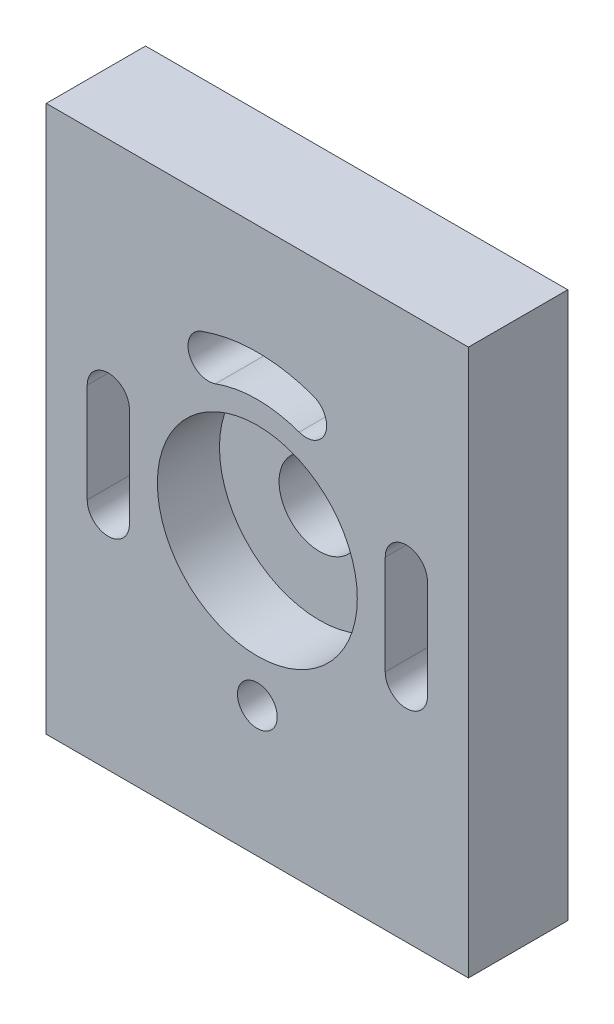
ISO-10303-21;
HEADER;
FILE_DESCRIPTION(('STEP AP214'),'2;1');
FILE_NAME('part.step','',(''),(''),'','','');
FILE_SCHEMA(('AUTOMOTIVE_DESIGN { 1 0 10303 214 1 1 1 1 }'));
ENDSEC;
DATA;
#1=APPLICATION_CONTEXT('core data for automotive mechanical design processes');
#2=APPLICATION_PROTOCOL_DEFINITION('international standard','automotive_design',2000,#1);
#3=PRODUCT_CONTEXT('',#1,'mechanical');
#4=PRODUCT('Part','Part','',(#3));
#5=PRODUCT_RELATED_PRODUCT_CATEGORY('part','',(#4));
#6=PRODUCT_DEFINITION_FORMATION('','',#4);
#7=PRODUCT_DEFINITION_CONTEXT('part definition',#1,'design');
#8=PRODUCT_DEFINITION('design','',#6,#7);
#9=PRODUCT_DEFINITION_SHAPE('','',#8);
#10=(LENGTH_UNIT() NAMED_UNIT(*) SI_UNIT(.MILLI.,.METRE.));
#11=(NAMED_UNIT(*) PLANE_ANGLE_UNIT() SI_UNIT($,.RADIAN.));
#12=(NAMED_UNIT(*) SI_UNIT($,.STERADIAN.) SOLID_ANGLE_UNIT());
#13=UNCERTAINTY_MEASURE_WITH_UNIT(LENGTH_MEASURE(1.E-05),#10,'distance_accuracy_value','');
#14=(GEOMETRIC_REPRESENTATION_CONTEXT(3) GLOBAL_UNCERTAINTY_ASSIGNED_CONTEXT((#13)) GLOBAL_UNIT_ASSIGNED_CONTEXT((#10,
#11,#12)) REPRESENTATION_CONTEXT('',''));
#15=CARTESIAN_POINT('',(0.,0.,0.));
#16=DIRECTION('',(0.,0.,1.));
#17=DIRECTION('',(1.,0.,0.));
#18=AXIS2_PLACEMENT_3D('',#15,#16,#17);
#19=CARTESIAN_POINT('',(0.,0.,3.));
#20=DIRECTION('',(0.,0.,1.));
#21=DIRECTION('',(1.,0.,0.));
#22=AXIS2_PLACEMENT_3D('',#19,#20,#21);
#23=PLANE('',#22);
#24=CARTESIAN_POINT('',(0.,0.,3.));
#25=DIRECTION('',(0.,0.,1.));
#26=DIRECTION('',(1.,0.,0.));
#27=AXIS2_PLACEMENT_3D('',#24,#25,#26);
#28=CIRCLE('',#27,3.25);
#29=CARTESIAN_POINT('',(3.25,0.,3.));
#30=VERTEX_POINT('',#29);
#31=EDGE_CURVE('E11',#30,#30,#28,.T.);
#32=ORIENTED_EDGE('',*,*,#31,.F.);
#33=EDGE_LOOP('',(#32));
#34=FACE_BOUND('',#33,.T.);
#35=CARTESIAN_POINT('',(0.,0.,3.));
#36=DIRECTION('',(0.,0.,1.));
#37=DIRECTION('',(1.,0.,0.));
#38=AXIS2_PLACEMENT_3D('',#35,#36,#37);
#39=CIRCLE('',#38,8.05);
#40=CARTESIAN_POINT('',(8.05,0.,3.));
#41=VERTEX_POINT('',#40);
#42=EDGE_CURVE('E332',#41,#41,#39,.T.);
#43=ORIENTED_EDGE('',*,*,#42,.T.);
#44=EDGE_LOOP('',(#43));
#45=FACE_BOUND('',#44,.T.);
#46=ADVANCED_FACE('F17',(#34,#45),#23,.T.);
#47=CARTESIAN_POINT('',(0.,0.,-12.));
#48=DIRECTION('',(0.,0.,1.));
#49=DIRECTION('',(1.,0.,0.));
#50=AXIS2_PLACEMENT_3D('',#47,#48,#49);
#51=CYLINDRICAL_SURFACE('',#50,3.25);
#52=ORIENTED_EDGE('',*,*,#31,.T.);
#53=EDGE_LOOP('',(#52));
#54=FACE_BOUND('',#53,.T.);
#55=CARTESIAN_POINT('',(0.,0.,0.));
#56=DIRECTION('',(0.,0.,1.));
#57=DIRECTION('',(1.,0.,0.));
#58=AXIS2_PLACEMENT_3D('',#55,#56,#57);
#59=CIRCLE('',#58,3.25);
#60=CARTESIAN_POINT('',(3.25,0.,0.));
#61=VERTEX_POINT('',#60);
#62=EDGE_CURVE('E230',#61,#61,#59,.T.);
#63=ORIENTED_EDGE('',*,*,#62,.F.);
#64=EDGE_LOOP('',(#63));
#65=FACE_BOUND('',#64,.T.);
#66=ADVANCED_FACE('F418',(#54,#65),#51,.F.);
#67=CARTESIAN_POINT('',(-3.933231648245,10.806465139038,-12.));
#68=DIRECTION('',(0.,0.,-1.));
#69=DIRECTION('',(0.939692620785813,0.342020143325932,0.));
#70=AXIS2_PLACEMENT_3D('',#67,#68,#69);
#71=CYLINDRICAL_SURFACE('',#70,1.65);
#72=DIRECTION('',(0.,0.,1.));
#73=VECTOR('',#72,1.);
#74=CARTESIAN_POINT('',(-4.497564884733,12.356957963335,-12.));
#75=LINE('',#74,#73);
#76=CARTESIAN_POINT('',(-4.497564884733,12.356957963335,0.));
#77=VERTEX_POINT('',#76);
#78=CARTESIAN_POINT('',(-4.497564884733,12.356957963335,8.));
#79=VERTEX_POINT('',#78);
#80=EDGE_CURVE('E25',#77,#79,#75,.T.);
#81=ORIENTED_EDGE('',*,*,#80,.T.);
#82=CARTESIAN_POINT('',(-3.933231648245,10.806465139038,8.));
#83=DIRECTION('',(0.,0.,-1.));
#84=DIRECTION('',(0.939692620785813,0.342020143325932,0.));
#85=AXIS2_PLACEMENT_3D('',#82,#83,#84);
#86=CIRCLE('',#85,1.65);
#87=CARTESIAN_POINT('',(-3.368898411758,9.255972314741,8.));
#88=VERTEX_POINT('',#87);
#89=EDGE_CURVE('E276',#88,#79,#86,.T.);
#90=ORIENTED_EDGE('',*,*,#89,.F.);
#91=DIRECTION('',(0.,0.,1.));
#92=VECTOR('',#91,1.);
#93=CARTESIAN_POINT('',(-3.368898411758,9.255972314741,-12.));
#94=LINE('',#93,#92);
#95=CARTESIAN_POINT('',(-3.368898411758,9.255972314741,0.));
#96=VERTEX_POINT('',#95);
#97=EDGE_CURVE('E37',#96,#88,#94,.T.);
#98=ORIENTED_EDGE('',*,*,#97,.F.);
#99=CARTESIAN_POINT('',(-3.933231648245,10.806465139038,0.));
#100=DIRECTION('',(0.,0.,-1.));
#101=DIRECTION('',(0.939692620785813,0.342020143325932,0.));
#102=AXIS2_PLACEMENT_3D('',#99,#100,#101);
#103=CIRCLE('',#102,1.65);
#104=EDGE_CURVE('E253',#96,#77,#103,.T.);
#105=ORIENTED_EDGE('',*,*,#104,.T.);
#106=EDGE_LOOP('',(#81,#90,#98,#105));
#107=FACE_BOUND('',#106,.T.);
#108=ADVANCED_FACE('F358',(#107),#71,.F.);
#109=CARTESIAN_POINT('',(0.,0.,-12.));
#110=DIRECTION('',(0.,0.,-1.));
#111=DIRECTION('',(1.,0.,0.));
#112=AXIS2_PLACEMENT_3D('',#109,#110,#111);
#113=CYLINDRICAL_SURFACE('',#112,13.15);
#114=ORIENTED_EDGE('',*,*,#80,.F.);
#115=CARTESIAN_POINT('',(0.,0.,0.));
#116=DIRECTION('',(0.,0.,-1.));
#117=DIRECTION('',(1.,0.,0.));
#118=AXIS2_PLACEMENT_3D('',#115,#116,#117);
#119=CIRCLE('',#118,13.15);
#120=CARTESIAN_POINT('',(4.497564884733,12.356957963335,0.));
#121=VERTEX_POINT('',#120);
#122=EDGE_CURVE('E250',#77,#121,#119,.T.);
#123=ORIENTED_EDGE('',*,*,#122,.T.);
#124=DIRECTION('',(0.,0.,1.));
#125=VECTOR('',#124,1.);
#126=CARTESIAN_POINT('',(4.497564884733,12.356957963335,-12.));
#127=LINE('',#126,#125);
#128=CARTESIAN_POINT('',(4.497564884733,12.356957963335,8.));
#129=VERTEX_POINT('',#128);
#130=EDGE_CURVE('E293',#121,#129,#127,.T.);
#131=ORIENTED_EDGE('',*,*,#130,.T.);
#132=CARTESIAN_POINT('',(0.,0.,8.));
#133=DIRECTION('',(0.,0.,-1.));
#134=DIRECTION('',(1.,0.,0.));
#135=AXIS2_PLACEMENT_3D('',#132,#133,#134);
#136=CIRCLE('',#135,13.15);
#137=EDGE_CURVE('E280',#79,#129,#136,.T.);
#138=ORIENTED_EDGE('',*,*,#137,.F.);
#139=EDGE_LOOP('',(#114,#123,#131,#138));
#140=FACE_BOUND('',#139,.T.);
#141=ADVANCED_FACE('F362',(#140),#113,.F.);
#142=CARTESIAN_POINT('',(3.933231648245,10.806465139038,-12.));
#143=DIRECTION('',(0.,0.,-1.));
#144=DIRECTION('',(-0.939692620785813,0.342020143325932,0.));
#145=AXIS2_PLACEMENT_3D('',#142,#143,#144);
#146=CYLINDRICAL_SURFACE('',#145,1.65);
#147=DIRECTION('',(0.,0.,1.));
#148=VECTOR('',#147,1.);
#149=CARTESIAN_POINT('',(3.368898411758,9.255972314741,-12.));
#150=LINE('',#149,#148);
#151=CARTESIAN_POINT('',(3.368898411758,9.255972314741,0.));
#152=VERTEX_POINT('',#151);
#153=CARTESIAN_POINT('',(3.368898411758,9.255972314741,8.));
#154=VERTEX_POINT('',#153);
#155=EDGE_CURVE('E290',#152,#154,#150,.T.);
#156=ORIENTED_EDGE('',*,*,#155,.T.);
#157=CARTESIAN_POINT('',(3.933231648245,10.806465139038,8.));
#158=DIRECTION('',(0.,0.,-1.));
#159=DIRECTION('',(-0.939692620785813,0.342020143325932,0.));
#160=AXIS2_PLACEMENT_3D('',#157,#158,#159);
#161=CIRCLE('',#160,1.65);
#162=EDGE_CURVE('E179',#129,#154,#161,.T.);
#163=ORIENTED_EDGE('',*,*,#162,.F.);
#164=ORIENTED_EDGE('',*,*,#130,.F.);
#165=CARTESIAN_POINT('',(3.933231648245,10.806465139038,0.));
#166=DIRECTION('',(0.,0.,-1.));
#167=DIRECTION('',(-0.939692620785813,0.342020143325932,0.));
#168=AXIS2_PLACEMENT_3D('',#165,#166,#167);
#169=CIRCLE('',#168,1.65);
#170=EDGE_CURVE('E254',#121,#152,#169,.T.);
#171=ORIENTED_EDGE('',*,*,#170,.T.);
#172=EDGE_LOOP('',(#156,#163,#164,#171));
#173=FACE_BOUND('',#172,.T.);
#174=ADVANCED_FACE('F571',(#173),#146,.F.);
#175=CARTESIAN_POINT('',(0.,0.,-12.));
#176=DIRECTION('',(0.,0.,-1.));
#177=DIRECTION('',(1.,0.,0.));
#178=AXIS2_PLACEMENT_3D('',#175,#176,#177);
#179=CYLINDRICAL_SURFACE('',#178,9.85);
#180=ORIENTED_EDGE('',*,*,#97,.T.);
#181=CARTESIAN_POINT('',(0.,0.,8.));
#182=DIRECTION('',(0.,0.,-1.));
#183=DIRECTION('',(1.,0.,0.));
#184=AXIS2_PLACEMENT_3D('',#181,#182,#183);
#185=CIRCLE('',#184,9.85);
#186=EDGE_CURVE('E272',#88,#154,#185,.T.);
#187=ORIENTED_EDGE('',*,*,#186,.T.);
#188=ORIENTED_EDGE('',*,*,#155,.F.);
#189=CARTESIAN_POINT('',(0.,0.,0.));
#190=DIRECTION('',(0.,0.,-1.));
#191=DIRECTION('',(1.,0.,0.));
#192=AXIS2_PLACEMENT_3D('',#189,#190,#191);
#193=CIRCLE('',#192,9.85);
#194=EDGE_CURVE('E323',#96,#152,#193,.T.);
#195=ORIENTED_EDGE('',*,*,#194,.F.);
#196=EDGE_LOOP('',(#180,#187,#188,#195));
#197=FACE_BOUND('',#196,.T.);
#198=ADVANCED_FACE('F368',(#197),#179,.T.);
#199=CARTESIAN_POINT('',(10.3,-4.,-12.));
#200=DIRECTION('',(1.,0.,0.));
#201=DIRECTION('',(0.,1.,0.));
#202=AXIS2_PLACEMENT_3D('',#199,#200,#201);
#203=PLANE('',#202);
#204=DIRECTION('',(0.,0.,1.));
#205=VECTOR('',#204,1.);
#206=CARTESIAN_POINT('',(10.3,-4.,-12.));
#207=LINE('',#206,#205);
#208=CARTESIAN_POINT('',(10.3,-4.,0.));
#209=VERTEX_POINT('',#208);
#210=CARTESIAN_POINT('',(10.3,-4.,8.));
#211=VERTEX_POINT('',#210);
#212=EDGE_CURVE('E349',#209,#211,#207,.T.);
#213=ORIENTED_EDGE('',*,*,#212,.F.);
#214=DIRECTION('',(0.,1.,0.));
#215=VECTOR('',#214,1.);
#216=CARTESIAN_POINT('',(10.3,-13.,0.));
#217=LINE('',#216,#215);
#218=CARTESIAN_POINT('',(10.3,4.,0.));
#219=VERTEX_POINT('',#218);
#220=EDGE_CURVE('E229',#209,#219,#217,.T.);
#221=ORIENTED_EDGE('',*,*,#220,.T.);
#222=DIRECTION('',(0.,0.,1.));
#223=VECTOR('',#222,1.);
#224=CARTESIAN_POINT('',(10.3,4.,-12.));
#225=LINE('',#224,#223);
#226=CARTESIAN_POINT('',(10.3,4.,8.));
#227=VERTEX_POINT('',#226);
#228=EDGE_CURVE('E350',#219,#227,#225,.T.);
#229=ORIENTED_EDGE('',*,*,#228,.T.);
#230=DIRECTION('',(0.,1.,0.));
#231=VECTOR('',#230,1.);
#232=CARTESIAN_POINT('',(10.3,-13.,8.));
#233=LINE('',#232,#231);
#234=EDGE_CURVE('E267',#211,#227,#233,.T.);
#235=ORIENTED_EDGE('',*,*,#234,.F.);
#236=EDGE_LOOP('',(#213,#221,#229,#235));
#237=FACE_BOUND('',#236,.T.);
#238=ADVANCED_FACE('F396',(#237),#203,.T.);
#239=CARTESIAN_POINT('',(12.,4.,-12.));
#240=DIRECTION('',(0.,0.,1.));
#241=DIRECTION('',(1.,0.,0.));
#242=AXIS2_PLACEMENT_3D('',#239,#240,#241);
#243=CYLINDRICAL_SURFACE('',#242,1.7);
#244=ORIENTED_EDGE('',*,*,#228,.F.);
#245=CARTESIAN_POINT('',(12.,4.,0.));
#246=DIRECTION('',(0.,0.,1.));
#247=DIRECTION('',(1.,0.,0.));
#248=AXIS2_PLACEMENT_3D('',#245,#246,#247);
#249=CIRCLE('',#248,1.7);
#250=CARTESIAN_POINT('',(13.7,4.,0.));
#251=VERTEX_POINT('',#250);
#252=EDGE_CURVE('E225',#251,#219,#249,.T.);
#253=ORIENTED_EDGE('',*,*,#252,.F.);
#254=DIRECTION('',(0.,0.,1.));
#255=VECTOR('',#254,1.);
#256=CARTESIAN_POINT('',(13.7,4.,-12.));
#257=LINE('',#256,#255);
#258=CARTESIAN_POINT('',(13.7,4.,8.));
#259=VERTEX_POINT('',#258);
#260=EDGE_CURVE('E328',#251,#259,#257,.T.);
#261=ORIENTED_EDGE('',*,*,#260,.T.);
#262=CARTESIAN_POINT('',(12.,4.,8.));
#263=DIRECTION('',(0.,0.,1.));
#264=DIRECTION('',(1.,0.,0.));
#265=AXIS2_PLACEMENT_3D('',#262,#263,#264);
#266=CIRCLE('',#265,1.7);
#267=EDGE_CURVE('E268',#259,#227,#266,.T.);
#268=ORIENTED_EDGE('',*,*,#267,.T.);
#269=EDGE_LOOP('',(#244,#253,#261,#268));
#270=FACE_BOUND('',#269,.T.);
#271=ADVANCED_FACE('F405',(#270),#243,.F.);
#272=CARTESIAN_POINT('',(12.,-4.,-12.));
#273=DIRECTION('',(0.,0.,1.));
#274=DIRECTION('',(1.,0.,0.));
#275=AXIS2_PLACEMENT_3D('',#272,#273,#274);
#276=CYLINDRICAL_SURFACE('',#275,1.7);
#277=CARTESIAN_POINT('',(12.,-4.,0.));
#278=DIRECTION('',(0.,0.,1.));
#279=DIRECTION('',(1.,0.,0.));
#280=AXIS2_PLACEMENT_3D('',#277,#278,#279);
#281=CIRCLE('',#280,1.7);
#282=CARTESIAN_POINT('',(13.7,-4.,0.));
#283=VERTEX_POINT('',#282);
#284=EDGE_CURVE('E303',#209,#283,#281,.T.);
#285=ORIENTED_EDGE('',*,*,#284,.F.);
#286=ORIENTED_EDGE('',*,*,#212,.T.);
#287=CARTESIAN_POINT('',(12.,-4.,8.));
#288=DIRECTION('',(0.,0.,1.));
#289=DIRECTION('',(1.,0.,0.));
#290=AXIS2_PLACEMENT_3D('',#287,#288,#289);
#291=CIRCLE('',#290,1.7);
#292=CARTESIAN_POINT('',(13.7,-4.,8.));
#293=VERTEX_POINT('',#292);
#294=EDGE_CURVE('E263',#211,#293,#291,.T.);
#295=ORIENTED_EDGE('',*,*,#294,.T.);
#296=DIRECTION('',(0.,0.,1.));
#297=VECTOR('',#296,1.);
#298=CARTESIAN_POINT('',(13.7,-4.,-12.));
#299=LINE('',#298,#297);
#300=EDGE_CURVE('E331',#283,#293,#299,.T.);
#301=ORIENTED_EDGE('',*,*,#300,.F.);
#302=EDGE_LOOP('',(#285,#286,#295,#301));
#303=FACE_BOUND('',#302,.T.);
#304=ADVANCED_FACE('F391',(#303),#276,.F.);
#305=CARTESIAN_POINT('',(13.7,-4.,-12.));
#306=DIRECTION('',(1.,0.,0.));
#307=DIRECTION('',(0.,1.,0.));
#308=AXIS2_PLACEMENT_3D('',#305,#306,#307);
#309=PLANE('',#308);
#310=DIRECTION('',(0.,1.,0.));
#311=VECTOR('',#310,1.);
#312=CARTESIAN_POINT('',(13.7,-13.,8.));
#313=LINE('',#312,#311);
#314=EDGE_CURVE('E262',#293,#259,#313,.T.);
#315=ORIENTED_EDGE('',*,*,#314,.T.);
#316=ORIENTED_EDGE('',*,*,#260,.F.);
#317=DIRECTION('',(0.,1.,0.));
#318=VECTOR('',#317,1.);
#319=CARTESIAN_POINT('',(13.7,-13.,0.));
#320=LINE('',#319,#318);
#321=EDGE_CURVE('E317',#283,#251,#320,.T.);
#322=ORIENTED_EDGE('',*,*,#321,.F.);
#323=ORIENTED_EDGE('',*,*,#300,.T.);
#324=EDGE_LOOP('',(#315,#316,#322,#323));
#325=FACE_BOUND('',#324,.T.);
#326=ADVANCED_FACE('F400',(#325),#309,.F.);
#327=CARTESIAN_POINT('',(0.,0.,3.));
#328=DIRECTION('',(0.,0.,1.));
#329=DIRECTION('',(1.,0.,0.));
#330=AXIS2_PLACEMENT_3D('',#327,#328,#329);
#331=CYLINDRICAL_SURFACE('',#330,8.05);
#332=CARTESIAN_POINT('',(0.,0.,8.));
#333=DIRECTION('',(0.,0.,1.));
#334=DIRECTION('',(1.,0.,0.));
#335=AXIS2_PLACEMENT_3D('',#332,#333,#334);
#336=CIRCLE('',#335,8.05);
#337=CARTESIAN_POINT('',(8.05,0.,8.));
#338=VERTEX_POINT('',#337);
#339=EDGE_CURVE('E258',#338,#338,#336,.T.);
#340=ORIENTED_EDGE('',*,*,#339,.T.);
#341=EDGE_LOOP('',(#340));
#342=FACE_BOUND('',#341,.T.);
#343=ORIENTED_EDGE('',*,*,#42,.F.);
#344=EDGE_LOOP('',(#343));
#345=FACE_BOUND('',#344,.T.);
#346=ADVANCED_FACE('F428',(#342,#345),#331,.F.);
#347=CARTESIAN_POINT('',(-13.7,-4.,-12.));
#348=DIRECTION('',(1.,0.,0.));
#349=DIRECTION('',(0.,1.,0.));
#350=AXIS2_PLACEMENT_3D('',#347,#348,#349);
#351=PLANE('',#350);
#352=DIRECTION('',(0.,0.,1.));
#353=VECTOR('',#352,1.);
#354=CARTESIAN_POINT('',(-13.7,-4.,-12.));
#355=LINE('',#354,#353);
#356=CARTESIAN_POINT('',(-13.7,-4.,0.));
#357=VERTEX_POINT('',#356);
#358=CARTESIAN_POINT('',(-13.7,-4.,8.));
#359=VERTEX_POINT('',#358);
#360=EDGE_CURVE('E338',#357,#359,#355,.T.);
#361=ORIENTED_EDGE('',*,*,#360,.F.);
#362=DIRECTION('',(0.,1.,0.));
#363=VECTOR('',#362,1.);
#364=CARTESIAN_POINT('',(-13.7,-13.,0.));
#365=LINE('',#364,#363);
#366=CARTESIAN_POINT('',(-13.7,4.,0.));
#367=VERTEX_POINT('',#366);
#368=EDGE_CURVE('E206',#357,#367,#365,.T.);
#369=ORIENTED_EDGE('',*,*,#368,.T.);
#370=DIRECTION('',(0.,0.,1.));
#371=VECTOR('',#370,1.);
#372=CARTESIAN_POINT('',(-13.7,4.,-12.));
#373=LINE('',#372,#371);
#374=CARTESIAN_POINT('',(-13.7,4.,8.));
#375=VERTEX_POINT('',#374);
#376=EDGE_CURVE('E341',#367,#375,#373,.T.);
#377=ORIENTED_EDGE('',*,*,#376,.T.);
#378=DIRECTION('',(0.,1.,0.));
#379=VECTOR('',#378,1.);
#380=CARTESIAN_POINT('',(-13.7,-13.,8.));
#381=LINE('',#380,#379);
#382=EDGE_CURVE('E245',#359,#375,#381,.T.);
#383=ORIENTED_EDGE('',*,*,#382,.F.);
#384=EDGE_LOOP('',(#361,#369,#377,#383));
#385=FACE_BOUND('',#384,.T.);
#386=ADVANCED_FACE('F430',(#385),#351,.T.);
#387=CARTESIAN_POINT('',(-12.,4.,-12.));
#388=DIRECTION('',(0.,0.,1.));
#389=DIRECTION('',(1.,0.,0.));
#390=AXIS2_PLACEMENT_3D('',#387,#388,#389);
#391=CYLINDRICAL_SURFACE('',#390,1.7);
#392=ORIENTED_EDGE('',*,*,#376,.F.);
#393=CARTESIAN_POINT('',(-12.,4.,0.));
#394=DIRECTION('',(0.,0.,1.));
#395=DIRECTION('',(1.,0.,0.));
#396=AXIS2_PLACEMENT_3D('',#393,#394,#395);
#397=CIRCLE('',#396,1.7);
#398=CARTESIAN_POINT('',(-10.3,4.,0.));
#399=VERTEX_POINT('',#398);
#400=EDGE_CURVE('E211',#399,#367,#397,.T.);
#401=ORIENTED_EDGE('',*,*,#400,.F.);
#402=DIRECTION('',(0.,0.,1.));
#403=VECTOR('',#402,1.);
#404=CARTESIAN_POINT('',(-10.3,4.,-12.));
#405=LINE('',#404,#403);
#406=CARTESIAN_POINT('',(-10.3,4.,8.));
#407=VERTEX_POINT('',#406);
#408=EDGE_CURVE('E327',#399,#407,#405,.T.);
#409=ORIENTED_EDGE('',*,*,#408,.T.);
#410=CARTESIAN_POINT('',(-12.,4.,8.));
#411=DIRECTION('',(0.,0.,1.));
#412=DIRECTION('',(1.,0.,0.));
#413=AXIS2_PLACEMENT_3D('',#410,#411,#412);
#414=CIRCLE('',#413,1.7);
#415=EDGE_CURVE('E249',#407,#375,#414,.T.);
#416=ORIENTED_EDGE('',*,*,#415,.T.);
#417=EDGE_LOOP('',(#392,#401,#409,#416));
#418=FACE_BOUND('',#417,.T.);
#419=ADVANCED_FACE('F437',(#418),#391,.F.);
#420=CARTESIAN_POINT('',(-12.,-4.,-12.));
#421=DIRECTION('',(0.,0.,1.));
#422=DIRECTION('',(1.,0.,0.));
#423=AXIS2_PLACEMENT_3D('',#420,#421,#422);
#424=CYLINDRICAL_SURFACE('',#423,1.7);
#425=CARTESIAN_POINT('',(-12.,-4.,0.));
#426=DIRECTION('',(0.,0.,1.));
#427=DIRECTION('',(1.,0.,0.));
#428=AXIS2_PLACEMENT_3D('',#425,#426,#427);
#429=CIRCLE('',#428,1.7);
#430=CARTESIAN_POINT('',(-10.3,-4.,0.));
#431=VERTEX_POINT('',#430);
#432=EDGE_CURVE('E210',#357,#431,#429,.T.);
#433=ORIENTED_EDGE('',*,*,#432,.F.);
#434=ORIENTED_EDGE('',*,*,#360,.T.);
#435=CARTESIAN_POINT('',(-12.,-4.,8.));
#436=DIRECTION('',(0.,0.,1.));
#437=DIRECTION('',(1.,0.,0.));
#438=AXIS2_PLACEMENT_3D('',#435,#436,#437);
#439=CIRCLE('',#438,1.7);
#440=CARTESIAN_POINT('',(-10.3,-4.,8.));
#441=VERTEX_POINT('',#440);
#442=EDGE_CURVE('E241',#359,#441,#439,.T.);
#443=ORIENTED_EDGE('',*,*,#442,.T.);
#444=DIRECTION('',(0.,0.,1.));
#445=VECTOR('',#444,1.);
#446=CARTESIAN_POINT('',(-10.3,-4.,-12.));
#447=LINE('',#446,#445);
#448=EDGE_CURVE('E335',#431,#441,#447,.T.);
#449=ORIENTED_EDGE('',*,*,#448,.F.);
#450=EDGE_LOOP('',(#433,#434,#443,#449));
#451=FACE_BOUND('',#450,.T.);
#452=ADVANCED_FACE('F454',(#451),#424,.F.);
#453=CARTESIAN_POINT('',(-10.3,-4.,-12.));
#454=DIRECTION('',(1.,0.,0.));
#455=DIRECTION('',(0.,1.,0.));
#456=AXIS2_PLACEMENT_3D('',#453,#454,#455);
#457=PLANE('',#456);
#458=DIRECTION('',(0.,1.,0.));
#459=VECTOR('',#458,1.);
#460=CARTESIAN_POINT('',(-10.3,-13.,8.));
#461=LINE('',#460,#459);
#462=EDGE_CURVE('E237',#441,#407,#461,.T.);
#463=ORIENTED_EDGE('',*,*,#462,.T.);
#464=ORIENTED_EDGE('',*,*,#408,.F.);
#465=DIRECTION('',(0.,1.,0.));
#466=VECTOR('',#465,1.);
#467=CARTESIAN_POINT('',(-10.3,-13.,0.));
#468=LINE('',#467,#466);
#469=EDGE_CURVE('E307',#431,#399,#468,.T.);
#470=ORIENTED_EDGE('',*,*,#469,.F.);
#471=ORIENTED_EDGE('',*,*,#448,.T.);
#472=EDGE_LOOP('',(#463,#464,#470,#471));
#473=FACE_BOUND('',#472,.T.);
#474=ADVANCED_FACE('F447',(#473),#457,.F.);
#475=CARTESIAN_POINT('',(0.,-11.5,-12.));
#476=DIRECTION('',(0.,0.,1.));
#477=DIRECTION('',(1.,0.,0.));
#478=AXIS2_PLACEMENT_3D('',#475,#476,#477);
#479=CYLINDRICAL_SURFACE('',#478,1.6);
#480=CARTESIAN_POINT('',(0.,-11.5,8.));
#481=DIRECTION('',(0.,0.,1.));
#482=DIRECTION('',(1.,0.,0.));
#483=AXIS2_PLACEMENT_3D('',#480,#481,#482);
#484=CIRCLE('',#483,1.6);
#485=CARTESIAN_POINT('',(1.6,-11.5,8.));
#486=VERTEX_POINT('',#485);
#487=EDGE_CURVE('E233',#486,#486,#484,.T.);
#488=ORIENTED_EDGE('',*,*,#487,.T.);
#489=EDGE_LOOP('',(#488));
#490=FACE_BOUND('',#489,.T.);
#491=CARTESIAN_POINT('',(0.,-11.5,0.));
#492=DIRECTION('',(0.,0.,1.));
#493=DIRECTION('',(1.,0.,0.));
#494=AXIS2_PLACEMENT_3D('',#491,#492,#493);
#495=CIRCLE('',#494,1.6);
#496=CARTESIAN_POINT('',(1.6,-11.5,0.));
#497=VERTEX_POINT('',#496);
#498=EDGE_CURVE('E289',#497,#497,#495,.T.);
#499=ORIENTED_EDGE('',*,*,#498,.F.);
#500=EDGE_LOOP('',(#499));
#501=FACE_BOUND('',#500,.T.);
#502=ADVANCED_FACE('F443',(#490,#501),#479,.F.);
#503=CARTESIAN_POINT('',(17.,-22.,0.));
#504=DIRECTION('',(1.,0.,0.));
#505=DIRECTION('',(0.,1.,0.));
#506=AXIS2_PLACEMENT_3D('',#503,#504,#505);
#507=PLANE('',#506);
#508=DIRECTION('',(0.,0.,1.));
#509=VECTOR('',#508,1.);
#510=CARTESIAN_POINT('',(17.,-22.,0.));
#511=LINE('',#510,#509);
#512=CARTESIAN_POINT('',(17.,-22.,0.));
#513=VERTEX_POINT('',#512);
#514=CARTESIAN_POINT('',(17.,-22.,8.));
#515=VERTEX_POINT('',#514);
#516=EDGE_CURVE('E214',#513,#515,#511,.T.);
#517=ORIENTED_EDGE('',*,*,#516,.F.);
#518=DIRECTION('',(0.,1.,0.));
#519=VECTOR('',#518,1.);
#520=CARTESIAN_POINT('',(17.,-22.,0.));
#521=LINE('',#520,#519);
#522=CARTESIAN_POINT('',(17.,22.,0.));
#523=VERTEX_POINT('',#522);
#524=EDGE_CURVE('E221',#513,#523,#521,.T.);
#525=ORIENTED_EDGE('',*,*,#524,.T.);
#526=DIRECTION('',(0.,0.,1.));
#527=VECTOR('',#526,1.);
#528=CARTESIAN_POINT('',(17.,22.,0.));
#529=LINE('',#528,#527);
#530=CARTESIAN_POINT('',(17.,22.,8.));
#531=VERTEX_POINT('',#530);
#532=EDGE_CURVE('E176',#523,#531,#529,.T.);
#533=ORIENTED_EDGE('',*,*,#532,.T.);
#534=DIRECTION('',(0.,1.,0.));
#535=VECTOR('',#534,1.);
#536=CARTESIAN_POINT('',(17.,-22.,8.));
#537=LINE('',#536,#535);
#538=EDGE_CURVE('E203',#515,#531,#537,.T.);
#539=ORIENTED_EDGE('',*,*,#538,.F.);
#540=EDGE_LOOP('',(#517,#525,#533,#539));
#541=FACE_BOUND('',#540,.T.);
#542=ADVANCED_FACE('F446',(#541),#507,.T.);
#543=CARTESIAN_POINT('',(-17.,-22.,0.));
#544=DIRECTION('',(0.,0.,1.));
#545=DIRECTION('',(1.,0.,0.));
#546=AXIS2_PLACEMENT_3D('',#543,#544,#545);
#547=PLANE('',#546);
#548=ORIENTED_EDGE('',*,*,#170,.F.);
#549=ORIENTED_EDGE('',*,*,#122,.F.);
#550=ORIENTED_EDGE('',*,*,#104,.F.);
#551=ORIENTED_EDGE('',*,*,#194,.T.);
#552=EDGE_LOOP('',(#548,#549,#550,#551));
#553=FACE_BOUND('',#552,.T.);
#554=ORIENTED_EDGE('',*,*,#252,.T.);
#555=ORIENTED_EDGE('',*,*,#220,.F.);
#556=ORIENTED_EDGE('',*,*,#284,.T.);
#557=ORIENTED_EDGE('',*,*,#321,.T.);
#558=EDGE_LOOP('',(#554,#555,#556,#557));
#559=FACE_BOUND('',#558,.T.);
#560=ORIENTED_EDGE('',*,*,#62,.T.);
#561=EDGE_LOOP('',(#560));
#562=FACE_BOUND('',#561,.T.);
#563=ORIENTED_EDGE('',*,*,#400,.T.);
#564=ORIENTED_EDGE('',*,*,#368,.F.);
#565=ORIENTED_EDGE('',*,*,#432,.T.);
#566=ORIENTED_EDGE('',*,*,#469,.T.);
#567=EDGE_LOOP('',(#563,#564,#565,#566));
#568=FACE_BOUND('',#567,.T.);
#569=ORIENTED_EDGE('',*,*,#498,.T.);
#570=EDGE_LOOP('',(#569));
#571=FACE_BOUND('',#570,.T.);
#572=DIRECTION('',(1.,0.,0.));
#573=VECTOR('',#572,1.);
#574=CARTESIAN_POINT('',(-17.,22.,0.));
#575=LINE('',#574,#573);
#576=CARTESIAN_POINT('',(-17.,22.,0.));
#577=VERTEX_POINT('',#576);
#578=EDGE_CURVE('E169',#577,#523,#575,.T.);
#579=ORIENTED_EDGE('',*,*,#578,.T.);
#580=ORIENTED_EDGE('',*,*,#524,.F.);
#581=DIRECTION('',(1.,0.,0.));
#582=VECTOR('',#581,1.);
#583=CARTESIAN_POINT('',(-17.,-22.,0.));
#584=LINE('',#583,#582);
#585=CARTESIAN_POINT('',(-17.,-22.,0.));
#586=VERTEX_POINT('',#585);
#587=EDGE_CURVE('E185',#586,#513,#584,.T.);
#588=ORIENTED_EDGE('',*,*,#587,.F.);
#589=DIRECTION('',(0.,1.,0.));
#590=VECTOR('',#589,1.);
#591=CARTESIAN_POINT('',(-17.,-22.,0.));
#592=LINE('',#591,#590);
#593=EDGE_CURVE('E182',#586,#577,#592,.T.);
#594=ORIENTED_EDGE('',*,*,#593,.T.);
#595=EDGE_LOOP('',(#579,#580,#588,#594));
#596=FACE_BOUND('',#595,.T.);
#597=ADVANCED_FACE('F183',(#553,#559,#562,#568,#571,#596),#547,.F.);
#598=CARTESIAN_POINT('',(-17.,22.,0.));
#599=DIRECTION('',(0.,1.,0.));
#600=DIRECTION('',(1.,0.,0.));
#601=AXIS2_PLACEMENT_3D('',#598,#599,#600);
#602=PLANE('',#601);
#603=ORIENTED_EDGE('',*,*,#578,.F.);
#604=DIRECTION('',(0.,0.,1.));
#605=VECTOR('',#604,1.);
#606=CARTESIAN_POINT('',(-17.,22.,0.));
#607=LINE('',#606,#605);
#608=CARTESIAN_POINT('',(-17.,22.,8.));
#609=VERTEX_POINT('',#608);
#610=EDGE_CURVE('E174',#577,#609,#607,.T.);
#611=ORIENTED_EDGE('',*,*,#610,.T.);
#612=DIRECTION('',(1.,0.,0.));
#613=VECTOR('',#612,1.);
#614=CARTESIAN_POINT('',(-17.,22.,8.));
#615=LINE('',#614,#613);
#616=EDGE_CURVE('E218',#609,#531,#615,.T.);
#617=ORIENTED_EDGE('',*,*,#616,.T.);
#618=ORIENTED_EDGE('',*,*,#532,.F.);
#619=EDGE_LOOP('',(#603,#611,#617,#618));
#620=FACE_BOUND('',#619,.T.);
#621=ADVANCED_FACE('F171',(#620),#602,.T.);
#622=CARTESIAN_POINT('',(-17.,-22.,8.));
#623=DIRECTION('',(0.,0.,1.));
#624=DIRECTION('',(1.,0.,0.));
#625=AXIS2_PLACEMENT_3D('',#622,#623,#624);
#626=PLANE('',#625);
#627=ORIENTED_EDGE('',*,*,#186,.F.);
#628=ORIENTED_EDGE('',*,*,#89,.T.);
#629=ORIENTED_EDGE('',*,*,#137,.T.);
#630=ORIENTED_EDGE('',*,*,#162,.T.);
#631=EDGE_LOOP('',(#627,#628,#629,#630));
#632=FACE_BOUND('',#631,.T.);
#633=ORIENTED_EDGE('',*,*,#314,.F.);
#634=ORIENTED_EDGE('',*,*,#294,.F.);
#635=ORIENTED_EDGE('',*,*,#234,.T.);
#636=ORIENTED_EDGE('',*,*,#267,.F.);
#637=EDGE_LOOP('',(#633,#634,#635,#636));
#638=FACE_BOUND('',#637,.T.);
#639=ORIENTED_EDGE('',*,*,#339,.F.);
#640=EDGE_LOOP('',(#639));
#641=FACE_BOUND('',#640,.T.);
#642=ORIENTED_EDGE('',*,*,#462,.F.);
#643=ORIENTED_EDGE('',*,*,#442,.F.);
#644=ORIENTED_EDGE('',*,*,#382,.T.);
#645=ORIENTED_EDGE('',*,*,#415,.F.);
#646=EDGE_LOOP('',(#642,#643,#644,#645));
#647=FACE_BOUND('',#646,.T.);
#648=ORIENTED_EDGE('',*,*,#487,.F.);
#649=EDGE_LOOP('',(#648));
#650=FACE_BOUND('',#649,.T.);
#651=DIRECTION('',(0.,1.,0.));
#652=VECTOR('',#651,1.);
#653=CARTESIAN_POINT('',(-17.,-22.,8.));
#654=LINE('',#653,#652);
#655=CARTESIAN_POINT('',(-17.,-22.,8.));
#656=VERTEX_POINT('',#655);
#657=EDGE_CURVE('E194',#656,#609,#654,.T.);
#658=ORIENTED_EDGE('',*,*,#657,.F.);
#659=DIRECTION('',(1.,0.,0.));
#660=VECTOR('',#659,1.);
#661=CARTESIAN_POINT('',(-17.,-22.,8.));
#662=LINE('',#661,#660);
#663=EDGE_CURVE('E204',#656,#515,#662,.T.);
#664=ORIENTED_EDGE('',*,*,#663,.T.);
#665=ORIENTED_EDGE('',*,*,#538,.T.);
#666=ORIENTED_EDGE('',*,*,#616,.F.);
#667=EDGE_LOOP('',(#658,#664,#665,#666));
#668=FACE_BOUND('',#667,.T.);
#669=ADVANCED_FACE('F365',(#632,#638,#641,#647,#650,#668),#626,.T.);
#670=CARTESIAN_POINT('',(-17.,-22.,0.));
#671=DIRECTION('',(0.,1.,0.));
#672=DIRECTION('',(1.,0.,0.));
#673=AXIS2_PLACEMENT_3D('',#670,#671,#672);
#674=PLANE('',#673);
#675=ORIENTED_EDGE('',*,*,#516,.T.);
#676=ORIENTED_EDGE('',*,*,#663,.F.);
#677=DIRECTION('',(0.,0.,1.));
#678=VECTOR('',#677,1.);
#679=CARTESIAN_POINT('',(-17.,-22.,0.));
#680=LINE('',#679,#678);
#681=EDGE_CURVE('E190',#586,#656,#680,.T.);
#682=ORIENTED_EDGE('',*,*,#681,.F.);
#683=ORIENTED_EDGE('',*,*,#587,.T.);
#684=EDGE_LOOP('',(#675,#676,#682,#683));
#685=FACE_BOUND('',#684,.T.);
#686=ADVANCED_FACE('F476',(#685),#674,.F.);
#687=CARTESIAN_POINT('',(-17.,-22.,0.));
#688=DIRECTION('',(1.,0.,0.));
#689=DIRECTION('',(0.,1.,0.));
#690=AXIS2_PLACEMENT_3D('',#687,#688,#689);
#691=PLANE('',#690);
#692=ORIENTED_EDGE('',*,*,#657,.T.);
#693=ORIENTED_EDGE('',*,*,#610,.F.);
#694=ORIENTED_EDGE('',*,*,#593,.F.);
#695=ORIENTED_EDGE('',*,*,#681,.T.);
#696=EDGE_LOOP('',(#692,#693,#694,#695));
#697=FACE_BOUND('',#696,.T.);
#698=ADVANCED_FACE('F192',(#697),#691,.F.);
#699=CLOSED_SHELL('',(#46,#66,#108,#141,#174,#198,#238,#271,#304,#326,#346,#386,#419,#452,#474,
#502,#542,#597,#621,#669,#686,#698));
#700=MANIFOLD_SOLID_BREP('B1',#699);
#701=ADVANCED_BREP_SHAPE_REPRESENTATION('',(#18,#700),#14);
#702=SHAPE_DEFINITION_REPRESENTATION(#9,#701);
ENDSEC;
END-ISO-10303-21;
